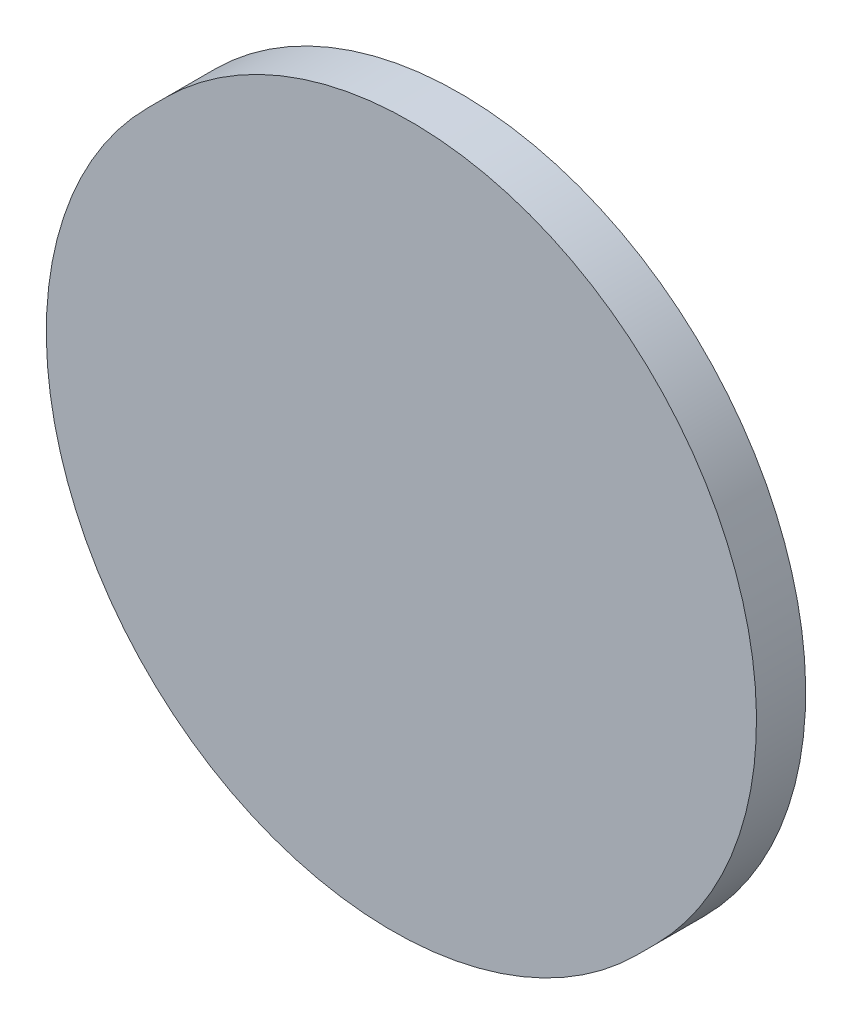
ISO-10303-21;
HEADER;
FILE_DESCRIPTION(('STEP AP214'),'2;1');
FILE_NAME('part.step','',(''),(''),'','','');
FILE_SCHEMA(('AUTOMOTIVE_DESIGN { 1 0 10303 214 1 1 1 1 }'));
ENDSEC;
DATA;
#1=APPLICATION_CONTEXT('core data for automotive mechanical design processes');
#2=APPLICATION_PROTOCOL_DEFINITION('international standard','automotive_design',2000,#1);
#3=PRODUCT_CONTEXT('',#1,'mechanical');
#4=PRODUCT('Part','Part','',(#3));
#5=PRODUCT_RELATED_PRODUCT_CATEGORY('part','',(#4));
#6=PRODUCT_DEFINITION_FORMATION('','',#4);
#7=PRODUCT_DEFINITION_CONTEXT('part definition',#1,'design');
#8=PRODUCT_DEFINITION('design','',#6,#7);
#9=PRODUCT_DEFINITION_SHAPE('','',#8);
#10=(LENGTH_UNIT() NAMED_UNIT(*) SI_UNIT(.MILLI.,.METRE.));
#11=(NAMED_UNIT(*) PLANE_ANGLE_UNIT() SI_UNIT($,.RADIAN.));
#12=(NAMED_UNIT(*) SI_UNIT($,.STERADIAN.) SOLID_ANGLE_UNIT());
#13=UNCERTAINTY_MEASURE_WITH_UNIT(LENGTH_MEASURE(1.E-05),#10,'distance_accuracy_value','');
#14=(GEOMETRIC_REPRESENTATION_CONTEXT(3) GLOBAL_UNCERTAINTY_ASSIGNED_CONTEXT((#13)) GLOBAL_UNIT_ASSIGNED_CONTEXT((#10,
#11,#12)) REPRESENTATION_CONTEXT('',''));
#15=CARTESIAN_POINT('',(0.,0.,0.));
#16=DIRECTION('',(0.,0.,1.));
#17=DIRECTION('',(1.,0.,0.));
#18=AXIS2_PLACEMENT_3D('',#15,#16,#17);
#19=CARTESIAN_POINT('',(110.64340838,100.86442362,0.));
#20=DIRECTION('',(-0.707106781186548,0.707106781186548,0.));
#21=DIRECTION('',(0.707106781186548,0.707106781186548,0.));
#22=AXIS2_PLACEMENT_3D('',#19,#20,#21);
#23=PLANE('',#22);
#24=DIRECTION('',(0.707106781186548,0.707106781186548,0.));
#25=VECTOR('',#24,1.);
#26=CARTESIAN_POINT('',(110.64340838,100.86442362,0.03556));
#27=LINE('',#26,#25);
#28=CARTESIAN_POINT('',(110.64340838,100.86442362,0.03556));
#29=VERTEX_POINT('',#28);
#30=CARTESIAN_POINT('',(110.65676878,100.87778402,0.03556));
#31=VERTEX_POINT('',#30);
#32=EDGE_CURVE('E11',#29,#31,#27,.T.);
#33=ORIENTED_EDGE('',*,*,#32,.F.);
#34=DIRECTION('',(0.,0.,1.));
#35=VECTOR('',#34,1.);
#36=CARTESIAN_POINT('',(110.64340838,100.86442362,0.));
#37=LINE('',#36,#35);
#38=CARTESIAN_POINT('',(110.64340838,100.86442362,0.));
#39=VERTEX_POINT('',#38);
#40=EDGE_CURVE('E24',#39,#29,#37,.T.);
#41=ORIENTED_EDGE('',*,*,#40,.F.);
#42=DIRECTION('',(0.707106781186548,0.707106781186548,0.));
#43=VECTOR('',#42,1.);
#44=CARTESIAN_POINT('',(110.64340838,100.86442362,0.));
#45=LINE('',#44,#43);
#46=CARTESIAN_POINT('',(110.65676878,100.87778402,0.));
#47=VERTEX_POINT('',#46);
#48=EDGE_CURVE('E75',#39,#47,#45,.T.);
#49=ORIENTED_EDGE('',*,*,#48,.T.);
#50=DIRECTION('',(0.,0.,1.));
#51=VECTOR('',#50,1.);
#52=CARTESIAN_POINT('',(110.65676878,100.87778402,0.));
#53=LINE('',#52,#51);
#54=EDGE_CURVE('E37',#47,#31,#53,.T.);
#55=ORIENTED_EDGE('',*,*,#54,.T.);
#56=EDGE_LOOP('',(#33,#41,#49,#55));
#57=FACE_BOUND('',#56,.T.);
#58=ADVANCED_FACE('F17',(#57),#23,.F.);
#59=CARTESIAN_POINT('',(110.4799924,101.0545604,0.));
#60=DIRECTION('',(0.,0.,-1.));
#61=DIRECTION('',(0.707106781186519,-0.707106781186576,0.));
#62=AXIS2_PLACEMENT_3D('',#59,#60,#61);
#63=CYLINDRICAL_SURFACE('',#62,0.24999955410322);
#64=CARTESIAN_POINT('',(110.4799924,101.0545604,0.03556));
#65=DIRECTION('',(0.,0.,1.));
#66=DIRECTION('',(0.707106781186519,-0.707106781186576,0.));
#67=AXIS2_PLACEMENT_3D('',#64,#65,#66);
#68=CIRCLE('',#67,0.24999955410322);
#69=CARTESIAN_POINT('',(110.30321602,101.23133678,0.03556));
#70=VERTEX_POINT('',#69);
#71=EDGE_CURVE('E83',#31,#70,#68,.T.);
#72=ORIENTED_EDGE('',*,*,#71,.F.);
#73=ORIENTED_EDGE('',*,*,#54,.F.);
#74=CARTESIAN_POINT('',(110.4799924,101.0545604,0.));
#75=DIRECTION('',(0.,0.,1.));
#76=DIRECTION('',(0.707106781186519,-0.707106781186576,0.));
#77=AXIS2_PLACEMENT_3D('',#74,#75,#76);
#78=CIRCLE('',#77,0.24999955410322);
#79=CARTESIAN_POINT('',(110.30321602,101.23133678,0.));
#80=VERTEX_POINT('',#79);
#81=EDGE_CURVE('E81',#47,#80,#78,.T.);
#82=ORIENTED_EDGE('',*,*,#81,.T.);
#83=DIRECTION('',(0.,0.,1.));
#84=VECTOR('',#83,1.);
#85=CARTESIAN_POINT('',(110.30321602,101.23133678,0.));
#86=LINE('',#85,#84);
#87=EDGE_CURVE('E67',#80,#70,#86,.T.);
#88=ORIENTED_EDGE('',*,*,#87,.T.);
#89=EDGE_LOOP('',(#72,#73,#82,#88));
#90=FACE_BOUND('',#89,.T.);
#91=ADVANCED_FACE('F89',(#90),#63,.T.);
#92=CARTESIAN_POINT('',(110.30321602,101.23133678,0.));
#93=DIRECTION('',(0.707106781186548,-0.707106781186548,0.));
#94=DIRECTION('',(-0.707106781186548,-0.707106781186548,0.));
#95=AXIS2_PLACEMENT_3D('',#92,#93,#94);
#96=PLANE('',#95);
#97=DIRECTION('',(-0.707106781186548,-0.707106781186548,0.));
#98=VECTOR('',#97,1.);
#99=CARTESIAN_POINT('',(110.30321602,101.23133678,0.03556));
#100=LINE('',#99,#98);
#101=CARTESIAN_POINT('',(110.28985562,101.21797638,0.03556));
#102=VERTEX_POINT('',#101);
#103=EDGE_CURVE('E71',#70,#102,#100,.T.);
#104=ORIENTED_EDGE('',*,*,#103,.F.);
#105=ORIENTED_EDGE('',*,*,#87,.F.);
#106=DIRECTION('',(-0.707106781186548,-0.707106781186548,0.));
#107=VECTOR('',#106,1.);
#108=CARTESIAN_POINT('',(110.30321602,101.23133678,0.));
#109=LINE('',#108,#107);
#110=CARTESIAN_POINT('',(110.28985562,101.21797638,0.));
#111=VERTEX_POINT('',#110);
#112=EDGE_CURVE('E63',#80,#111,#109,.T.);
#113=ORIENTED_EDGE('',*,*,#112,.T.);
#114=DIRECTION('',(0.,0.,1.));
#115=VECTOR('',#114,1.);
#116=CARTESIAN_POINT('',(110.28985562,101.21797638,0.));
#117=LINE('',#116,#115);
#118=EDGE_CURVE('E53',#111,#102,#117,.T.);
#119=ORIENTED_EDGE('',*,*,#118,.T.);
#120=EDGE_LOOP('',(#104,#105,#113,#119));
#121=FACE_BOUND('',#120,.T.);
#122=ADVANCED_FACE('F66',(#121),#96,.F.);
#123=CARTESIAN_POINT('',(110.466632,101.0412,0.));
#124=DIRECTION('',(0.,0.,-1.));
#125=DIRECTION('',(-0.707106781186576,0.707106781186519,0.));
#126=AXIS2_PLACEMENT_3D('',#123,#124,#125);
#127=CYLINDRICAL_SURFACE('',#126,0.249999554103223);
#128=CARTESIAN_POINT('',(110.466632,101.0412,0.03556));
#129=DIRECTION('',(0.,0.,1.));
#130=DIRECTION('',(-0.707106781186576,0.707106781186519,0.));
#131=AXIS2_PLACEMENT_3D('',#128,#129,#130);
#132=CIRCLE('',#131,0.249999554103223);
#133=EDGE_CURVE('E59',#102,#29,#132,.T.);
#134=ORIENTED_EDGE('',*,*,#133,.F.);
#135=ORIENTED_EDGE('',*,*,#118,.F.);
#136=CARTESIAN_POINT('',(110.466632,101.0412,0.));
#137=DIRECTION('',(0.,0.,1.));
#138=DIRECTION('',(-0.707106781186576,0.707106781186519,0.));
#139=AXIS2_PLACEMENT_3D('',#136,#137,#138);
#140=CIRCLE('',#139,0.249999554103223);
#141=EDGE_CURVE('E57',#111,#39,#140,.T.);
#142=ORIENTED_EDGE('',*,*,#141,.T.);
#143=ORIENTED_EDGE('',*,*,#40,.T.);
#144=EDGE_LOOP('',(#134,#135,#142,#143));
#145=FACE_BOUND('',#144,.T.);
#146=ADVANCED_FACE('F55',(#145),#127,.T.);
#147=CARTESIAN_POINT('',(110.64340838,100.86442362,0.));
#148=DIRECTION('',(0.,0.,-1.));
#149=DIRECTION('',(-1.,0.,0.));
#150=AXIS2_PLACEMENT_3D('',#147,#148,#149);
#151=PLANE('',#150);
#152=ORIENTED_EDGE('',*,*,#141,.F.);
#153=ORIENTED_EDGE('',*,*,#112,.F.);
#154=ORIENTED_EDGE('',*,*,#81,.F.);
#155=ORIENTED_EDGE('',*,*,#48,.F.);
#156=EDGE_LOOP('',(#152,#153,#154,#155));
#157=FACE_BOUND('',#156,.T.);
#158=ADVANCED_FACE('F74',(#157),#151,.T.);
#159=CARTESIAN_POINT('',(110.64340838,100.86442362,0.03556));
#160=DIRECTION('',(0.,0.,-1.));
#161=DIRECTION('',(-1.,0.,0.));
#162=AXIS2_PLACEMENT_3D('',#159,#160,#161);
#163=PLANE('',#162);
#164=ORIENTED_EDGE('',*,*,#32,.T.);
#165=ORIENTED_EDGE('',*,*,#71,.T.);
#166=ORIENTED_EDGE('',*,*,#103,.T.);
#167=ORIENTED_EDGE('',*,*,#133,.T.);
#168=EDGE_LOOP('',(#164,#165,#166,#167));
#169=FACE_BOUND('',#168,.T.);
#170=ADVANCED_FACE('F91',(#169),#163,.F.);
#171=CLOSED_SHELL('',(#58,#91,#122,#146,#158,#170));
#172=MANIFOLD_SOLID_BREP('B1',#171);
#173=ADVANCED_BREP_SHAPE_REPRESENTATION('',(#18,#172),#14);
#174=SHAPE_DEFINITION_REPRESENTATION(#9,#173);
ENDSEC;
END-ISO-10303-21;
